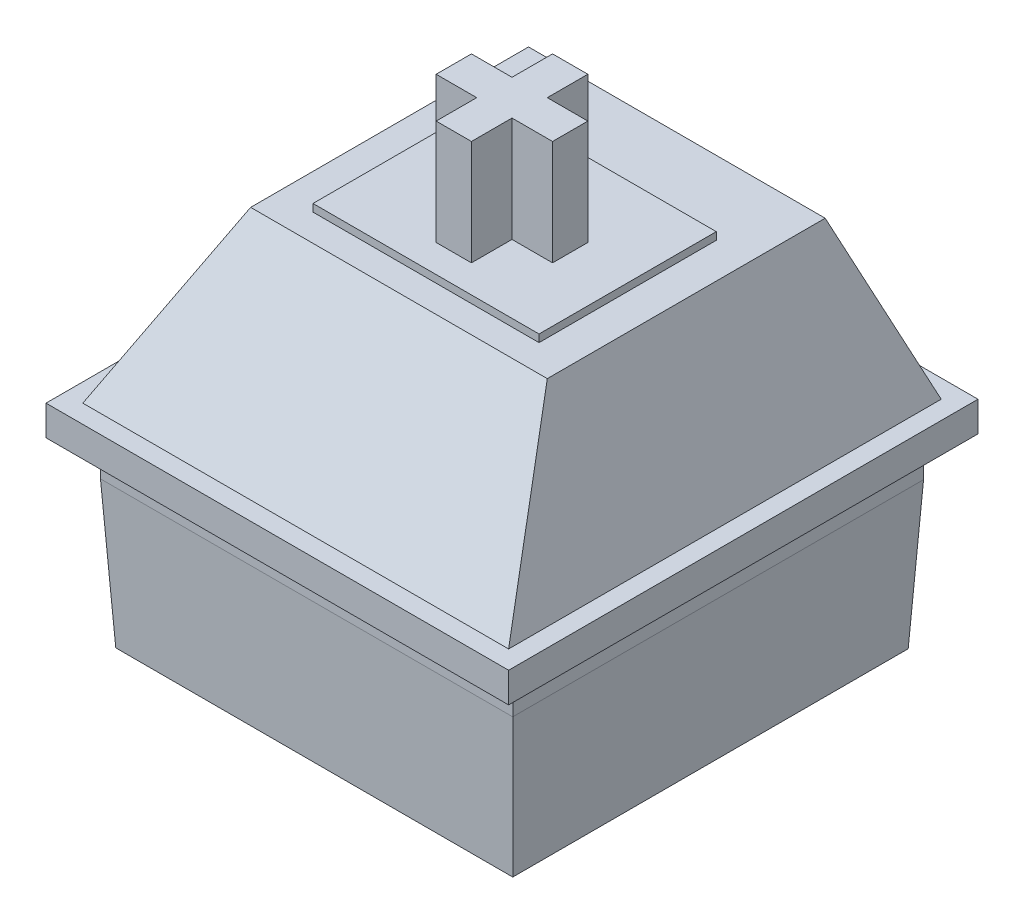
ISO-10303-21;
HEADER;
FILE_DESCRIPTION(('STEP AP214'),'2;1');
FILE_NAME('part.step','',(''),(''),'','','');
FILE_SCHEMA(('AUTOMOTIVE_DESIGN { 1 0 10303 214 1 1 1 1 }'));
ENDSEC;
DATA;
#1=APPLICATION_CONTEXT('core data for automotive mechanical design processes');
#2=APPLICATION_PROTOCOL_DEFINITION('international standard','automotive_design',2000,#1);
#3=PRODUCT_CONTEXT('',#1,'mechanical');
#4=PRODUCT('Part','Part','',(#3));
#5=PRODUCT_RELATED_PRODUCT_CATEGORY('part','',(#4));
#6=PRODUCT_DEFINITION_FORMATION('','',#4);
#7=PRODUCT_DEFINITION_CONTEXT('part definition',#1,'design');
#8=PRODUCT_DEFINITION('design','',#6,#7);
#9=PRODUCT_DEFINITION_SHAPE('','',#8);
#10=(LENGTH_UNIT() NAMED_UNIT(*) SI_UNIT(.MILLI.,.METRE.));
#11=(NAMED_UNIT(*) PLANE_ANGLE_UNIT() SI_UNIT($,.RADIAN.));
#12=(NAMED_UNIT(*) SI_UNIT($,.STERADIAN.) SOLID_ANGLE_UNIT());
#13=UNCERTAINTY_MEASURE_WITH_UNIT(LENGTH_MEASURE(1.E-05),#10,'distance_accuracy_value','');
#14=(GEOMETRIC_REPRESENTATION_CONTEXT(3) GLOBAL_UNCERTAINTY_ASSIGNED_CONTEXT((#13)) GLOBAL_UNIT_ASSIGNED_CONTEXT((#10,
#11,#12)) REPRESENTATION_CONTEXT('',''));
#15=CARTESIAN_POINT('',(0.,0.,0.));
#16=DIRECTION('',(0.,0.,1.));
#17=DIRECTION('',(1.,0.,0.));
#18=AXIS2_PLACEMENT_3D('',#15,#16,#17);
#19=CARTESIAN_POINT('',(0.,7.62,0.));
#20=DIRECTION('',(0.,1.,0.));
#21=DIRECTION('',(0.,0.,1.));
#22=AXIS2_PLACEMENT_3D('',#19,#20,#21);
#23=PLANE('',#22);
#24=DIRECTION('',(0.,0.,1.));
#25=VECTOR('',#24,1.);
#26=CARTESIAN_POINT('',(-3.8227,7.62,-3.0861));
#27=LINE('',#26,#25);
#28=CARTESIAN_POINT('',(-3.8227,7.62,-3.0861));
#29=VERTEX_POINT('',#28);
#30=CARTESIAN_POINT('',(-3.8227,7.62,2.9083));
#31=VERTEX_POINT('',#30);
#32=EDGE_CURVE('E499',#29,#31,#27,.T.);
#33=ORIENTED_EDGE('',*,*,#32,.T.);
#34=DIRECTION('',(1.,0.,0.));
#35=VECTOR('',#34,1.);
#36=CARTESIAN_POINT('',(-3.8227,7.62,2.9083));
#37=LINE('',#36,#35);
#38=CARTESIAN_POINT('',(3.8227,7.62,2.9083));
#39=VERTEX_POINT('',#38);
#40=EDGE_CURVE('E511',#31,#39,#37,.T.);
#41=ORIENTED_EDGE('',*,*,#40,.T.);
#42=DIRECTION('',(0.,0.,-1.));
#43=VECTOR('',#42,1.);
#44=CARTESIAN_POINT('',(3.8227,7.62,-3.0861));
#45=LINE('',#44,#43);
#46=CARTESIAN_POINT('',(3.8227,7.62,-3.0861));
#47=VERTEX_POINT('',#46);
#48=EDGE_CURVE('E509',#39,#47,#45,.T.);
#49=ORIENTED_EDGE('',*,*,#48,.T.);
#50=DIRECTION('',(-1.,0.,0.));
#51=VECTOR('',#50,1.);
#52=CARTESIAN_POINT('',(-3.8227,7.62,-3.0861));
#53=LINE('',#52,#51);
#54=EDGE_CURVE('E496',#47,#29,#53,.T.);
#55=ORIENTED_EDGE('',*,*,#54,.T.);
#56=EDGE_LOOP('',(#33,#41,#49,#55));
#57=FACE_BOUND('',#56,.T.);
#58=DIRECTION('',(0.,0.,1.));
#59=VECTOR('',#58,1.);
#60=CARTESIAN_POINT('',(-1.9685,7.62,0.596899999999991));
#61=LINE('',#60,#59);
#62=CARTESIAN_POINT('',(-1.9685,7.62,-0.596900000000006));
#63=VERTEX_POINT('',#62);
#64=CARTESIAN_POINT('',(-1.9685,7.62,0.596899999999991));
#65=VERTEX_POINT('',#64);
#66=EDGE_CURVE('E568',#63,#65,#61,.T.);
#67=ORIENTED_EDGE('',*,*,#66,.F.);
#68=DIRECTION('',(-1.,0.,0.));
#69=VECTOR('',#68,1.);
#70=CARTESIAN_POINT('',(-1.9685,7.62,-0.596900000000006));
#71=LINE('',#70,#69);
#72=CARTESIAN_POINT('',(-0.596899999999997,7.62,-0.596900000000006));
#73=VERTEX_POINT('',#72);
#74=EDGE_CURVE('E256',#73,#63,#71,.T.);
#75=ORIENTED_EDGE('',*,*,#74,.F.);
#76=DIRECTION('',(0.,0.,1.));
#77=VECTOR('',#76,1.);
#78=CARTESIAN_POINT('',(-0.596899999999997,7.62,-0.596900000000006));
#79=LINE('',#78,#77);
#80=CARTESIAN_POINT('',(-0.596899999999997,7.62,-1.96850000000001));
#81=VERTEX_POINT('',#80);
#82=EDGE_CURVE('E547',#81,#73,#79,.T.);
#83=ORIENTED_EDGE('',*,*,#82,.F.);
#84=DIRECTION('',(-1.,0.,0.));
#85=VECTOR('',#84,1.);
#86=CARTESIAN_POINT('',(-0.596899999999997,7.62,-1.96850000000001));
#87=LINE('',#86,#85);
#88=CARTESIAN_POINT('',(0.596900000000003,7.62,-1.96850000000001));
#89=VERTEX_POINT('',#88);
#90=EDGE_CURVE('E550',#89,#81,#87,.T.);
#91=ORIENTED_EDGE('',*,*,#90,.F.);
#92=DIRECTION('',(0.,0.,-1.));
#93=VECTOR('',#92,1.);
#94=CARTESIAN_POINT('',(0.596900000000003,7.62,-1.96850000000001));
#95=LINE('',#94,#93);
#96=CARTESIAN_POINT('',(0.596899999999999,7.62,-0.596900000000006));
#97=VERTEX_POINT('',#96);
#98=EDGE_CURVE('E552',#97,#89,#95,.T.);
#99=ORIENTED_EDGE('',*,*,#98,.F.);
#100=DIRECTION('',(-1.,0.,0.));
#101=VECTOR('',#100,1.);
#102=CARTESIAN_POINT('',(0.596899999999999,7.62,-0.596900000000006));
#103=LINE('',#102,#101);
#104=CARTESIAN_POINT('',(1.9685,7.62,-0.596900000000006));
#105=VERTEX_POINT('',#104);
#106=EDGE_CURVE('E554',#105,#97,#103,.T.);
#107=ORIENTED_EDGE('',*,*,#106,.F.);
#108=DIRECTION('',(0.,0.,-1.));
#109=VECTOR('',#108,1.);
#110=CARTESIAN_POINT('',(1.9685,7.62,-0.596900000000006));
#111=LINE('',#110,#109);
#112=CARTESIAN_POINT('',(1.9685,7.62,0.596899999999994));
#113=VERTEX_POINT('',#112);
#114=EDGE_CURVE('E556',#113,#105,#111,.T.);
#115=ORIENTED_EDGE('',*,*,#114,.F.);
#116=DIRECTION('',(1.,0.,0.));
#117=VECTOR('',#116,1.);
#118=CARTESIAN_POINT('',(1.9685,7.62,0.596899999999994));
#119=LINE('',#118,#117);
#120=CARTESIAN_POINT('',(0.596899999999999,7.62,0.596900000000006));
#121=VERTEX_POINT('',#120);
#122=EDGE_CURVE('E558',#121,#113,#119,.T.);
#123=ORIENTED_EDGE('',*,*,#122,.F.);
#124=DIRECTION('',(0.,0.,-1.));
#125=VECTOR('',#124,1.);
#126=CARTESIAN_POINT('',(0.596899999999999,7.62,0.596900000000006));
#127=LINE('',#126,#125);
#128=CARTESIAN_POINT('',(0.596900000000003,7.62,1.96849999999999));
#129=VERTEX_POINT('',#128);
#130=EDGE_CURVE('E560',#129,#121,#127,.T.);
#131=ORIENTED_EDGE('',*,*,#130,.F.);
#132=DIRECTION('',(1.,0.,0.));
#133=VECTOR('',#132,1.);
#134=CARTESIAN_POINT('',(0.596900000000003,7.62,1.96849999999999));
#135=LINE('',#134,#133);
#136=CARTESIAN_POINT('',(-0.596899999999997,7.62,1.96849999999999));
#137=VERTEX_POINT('',#136);
#138=EDGE_CURVE('E562',#137,#129,#135,.T.);
#139=ORIENTED_EDGE('',*,*,#138,.F.);
#140=DIRECTION('',(0.,0.,1.));
#141=VECTOR('',#140,1.);
#142=CARTESIAN_POINT('',(-0.596899999999997,7.62,1.96849999999999));
#143=LINE('',#142,#141);
#144=CARTESIAN_POINT('',(-0.596899999999997,7.62,0.596900000000006));
#145=VERTEX_POINT('',#144);
#146=EDGE_CURVE('E564',#145,#137,#143,.T.);
#147=ORIENTED_EDGE('',*,*,#146,.F.);
#148=DIRECTION('',(1.,0.,0.));
#149=VECTOR('',#148,1.);
#150=CARTESIAN_POINT('',(-0.596899999999997,7.62,0.596900000000006));
#151=LINE('',#150,#149);
#152=EDGE_CURVE('E566',#65,#145,#151,.T.);
#153=ORIENTED_EDGE('',*,*,#152,.F.);
#154=EDGE_LOOP('',(#67,#75,#83,#91,#99,#107,#115,#123,#131,#139,#147,#153));
#155=FACE_BOUND('',#154,.T.);
#156=ADVANCED_FACE('F45',(#57,#155),#23,.T.);
#157=CARTESIAN_POINT('',(0.,7.366,0.));
#158=DIRECTION('',(0.,1.,0.));
#159=DIRECTION('',(0.,0.,1.));
#160=AXIS2_PLACEMENT_3D('',#157,#158,#159);
#161=PLANE('',#160);
#162=DIRECTION('',(0.,0.,1.));
#163=VECTOR('',#162,1.);
#164=CARTESIAN_POINT('',(-5.0165,7.366,-5.5753));
#165=LINE('',#164,#163);
#166=CARTESIAN_POINT('',(-5.0165,7.366,-5.5753));
#167=VERTEX_POINT('',#166);
#168=CARTESIAN_POINT('',(-5.0165,7.366,3.8227));
#169=VERTEX_POINT('',#168);
#170=EDGE_CURVE('E460',#167,#169,#165,.T.);
#171=ORIENTED_EDGE('',*,*,#170,.T.);
#172=DIRECTION('',(1.,0.,0.));
#173=VECTOR('',#172,1.);
#174=CARTESIAN_POINT('',(-5.0165,7.366,3.8227));
#175=LINE('',#174,#173);
#176=CARTESIAN_POINT('',(5.0165,7.366,3.8227));
#177=VERTEX_POINT('',#176);
#178=EDGE_CURVE('E332',#169,#177,#175,.T.);
#179=ORIENTED_EDGE('',*,*,#178,.T.);
#180=DIRECTION('',(0.,0.,-1.));
#181=VECTOR('',#180,1.);
#182=CARTESIAN_POINT('',(5.0165,7.366,-5.5753));
#183=LINE('',#182,#181);
#184=CARTESIAN_POINT('',(5.0165,7.366,-5.5753));
#185=VERTEX_POINT('',#184);
#186=EDGE_CURVE('E343',#177,#185,#183,.T.);
#187=ORIENTED_EDGE('',*,*,#186,.T.);
#188=DIRECTION('',(-1.,0.,0.));
#189=VECTOR('',#188,1.);
#190=CARTESIAN_POINT('',(-5.0165,7.366,-5.5753));
#191=LINE('',#190,#189);
#192=EDGE_CURVE('E463',#185,#167,#191,.T.);
#193=ORIENTED_EDGE('',*,*,#192,.T.);
#194=EDGE_LOOP('',(#171,#179,#187,#193));
#195=FACE_BOUND('',#194,.T.);
#196=DIRECTION('',(1.,0.,0.));
#197=VECTOR('',#196,1.);
#198=CARTESIAN_POINT('',(-3.8227,7.366,2.9083));
#199=LINE('',#198,#197);
#200=CARTESIAN_POINT('',(-3.8227,7.366,2.9083));
#201=VERTEX_POINT('',#200);
#202=CARTESIAN_POINT('',(3.8227,7.366,2.9083));
#203=VERTEX_POINT('',#202);
#204=EDGE_CURVE('E502',#201,#203,#199,.T.);
#205=ORIENTED_EDGE('',*,*,#204,.F.);
#206=DIRECTION('',(0.,0.,1.));
#207=VECTOR('',#206,1.);
#208=CARTESIAN_POINT('',(-3.8227,7.366,-3.0861));
#209=LINE('',#208,#207);
#210=CARTESIAN_POINT('',(-3.8227,7.366,-3.0861));
#211=VERTEX_POINT('',#210);
#212=EDGE_CURVE('E504',#211,#201,#209,.T.);
#213=ORIENTED_EDGE('',*,*,#212,.F.);
#214=DIRECTION('',(-1.,0.,0.));
#215=VECTOR('',#214,1.);
#216=CARTESIAN_POINT('',(-3.8227,7.366,-3.0861));
#217=LINE('',#216,#215);
#218=CARTESIAN_POINT('',(3.8227,7.366,-3.0861));
#219=VERTEX_POINT('',#218);
#220=EDGE_CURVE('E497',#219,#211,#217,.T.);
#221=ORIENTED_EDGE('',*,*,#220,.F.);
#222=DIRECTION('',(0.,0.,-1.));
#223=VECTOR('',#222,1.);
#224=CARTESIAN_POINT('',(3.8227,7.366,-3.0861));
#225=LINE('',#224,#223);
#226=EDGE_CURVE('E500',#203,#219,#225,.T.);
#227=ORIENTED_EDGE('',*,*,#226,.F.);
#228=EDGE_LOOP('',(#205,#213,#221,#227));
#229=FACE_BOUND('',#228,.T.);
#230=ADVANCED_FACE('F403',(#195,#229),#161,.T.);
#231=CARTESIAN_POINT('',(6.9723,1.27,6.9469));
#232=DIRECTION('',(-1.,0.,0.));
#233=DIRECTION('',(0.,0.,1.));
#234=AXIS2_PLACEMENT_3D('',#231,#232,#233);
#235=PLANE('',#234);
#236=DIRECTION('',(0.,0.,-1.));
#237=VECTOR('',#236,1.);
#238=CARTESIAN_POINT('',(6.9723,0.,6.9469));
#239=LINE('',#238,#237);
#240=CARTESIAN_POINT('',(6.9723,0.,6.9469));
#241=VERTEX_POINT('',#240);
#242=CARTESIAN_POINT('',(6.9723,0.,-6.9469));
#243=VERTEX_POINT('',#242);
#244=EDGE_CURVE('E250',#241,#243,#239,.T.);
#245=ORIENTED_EDGE('',*,*,#244,.T.);
#246=DIRECTION('',(0.,-1.,0.));
#247=VECTOR('',#246,1.);
#248=CARTESIAN_POINT('',(6.9723,1.27,-6.9469));
#249=LINE('',#248,#247);
#250=CARTESIAN_POINT('',(6.9723,1.27,-6.9469));
#251=VERTEX_POINT('',#250);
#252=EDGE_CURVE('E12',#251,#243,#249,.T.);
#253=ORIENTED_EDGE('',*,*,#252,.F.);
#254=DIRECTION('',(0.,0.,-1.));
#255=VECTOR('',#254,1.);
#256=CARTESIAN_POINT('',(6.9723,1.27,6.9469));
#257=LINE('',#256,#255);
#258=CARTESIAN_POINT('',(6.9723,1.27,6.9469));
#259=VERTEX_POINT('',#258);
#260=EDGE_CURVE('E292',#259,#251,#257,.T.);
#261=ORIENTED_EDGE('',*,*,#260,.F.);
#262=DIRECTION('',(0.,-1.,0.));
#263=VECTOR('',#262,1.);
#264=CARTESIAN_POINT('',(6.9723,1.27,6.9469));
#265=LINE('',#264,#263);
#266=EDGE_CURVE('E277',#259,#241,#265,.T.);
#267=ORIENTED_EDGE('',*,*,#266,.T.);
#268=EDGE_LOOP('',(#245,#253,#261,#267));
#269=FACE_BOUND('',#268,.T.);
#270=ADVANCED_FACE('F47',(#269),#235,.F.);
#271=CARTESIAN_POINT('',(-6.9723,1.27,-6.9469));
#272=DIRECTION('',(0.,0.,1.));
#273=DIRECTION('',(1.,0.,0.));
#274=AXIS2_PLACEMENT_3D('',#271,#272,#273);
#275=PLANE('',#274);
#276=DIRECTION('',(-1.,0.,0.));
#277=VECTOR('',#276,1.);
#278=CARTESIAN_POINT('',(-6.9723,0.,-6.9469));
#279=LINE('',#278,#277);
#280=CARTESIAN_POINT('',(-6.9723,0.,-6.9469));
#281=VERTEX_POINT('',#280);
#282=EDGE_CURVE('E260',#243,#281,#279,.T.);
#283=ORIENTED_EDGE('',*,*,#282,.T.);
#284=DIRECTION('',(0.,-1.,0.));
#285=VECTOR('',#284,1.);
#286=CARTESIAN_POINT('',(-6.9723,1.27,-6.9469));
#287=LINE('',#286,#285);
#288=CARTESIAN_POINT('',(-6.9723,1.27,-6.9469));
#289=VERTEX_POINT('',#288);
#290=EDGE_CURVE('E54',#289,#281,#287,.T.);
#291=ORIENTED_EDGE('',*,*,#290,.F.);
#292=DIRECTION('',(-1.,0.,0.));
#293=VECTOR('',#292,1.);
#294=CARTESIAN_POINT('',(-6.9723,1.27,-6.9469));
#295=LINE('',#294,#293);
#296=EDGE_CURVE('E272',#251,#289,#295,.T.);
#297=ORIENTED_EDGE('',*,*,#296,.F.);
#298=ORIENTED_EDGE('',*,*,#252,.T.);
#299=EDGE_LOOP('',(#283,#291,#297,#298));
#300=FACE_BOUND('',#299,.T.);
#301=ADVANCED_FACE('F270',(#300),#275,.F.);
#302=CARTESIAN_POINT('',(-6.9723,1.27,6.9469));
#303=DIRECTION('',(1.,0.,0.));
#304=DIRECTION('',(0.,0.,-1.));
#305=AXIS2_PLACEMENT_3D('',#302,#303,#304);
#306=PLANE('',#305);
#307=DIRECTION('',(0.,0.,1.));
#308=VECTOR('',#307,1.);
#309=CARTESIAN_POINT('',(-6.9723,0.,6.9469));
#310=LINE('',#309,#308);
#311=CARTESIAN_POINT('',(-6.9723,0.,6.9469));
#312=VERTEX_POINT('',#311);
#313=EDGE_CURVE('E267',#281,#312,#310,.T.);
#314=ORIENTED_EDGE('',*,*,#313,.T.);
#315=DIRECTION('',(0.,-1.,0.));
#316=VECTOR('',#315,1.);
#317=CARTESIAN_POINT('',(-6.9723,1.27,6.9469));
#318=LINE('',#317,#316);
#319=CARTESIAN_POINT('',(-6.9723,1.27,6.9469));
#320=VERTEX_POINT('',#319);
#321=EDGE_CURVE('E294',#320,#312,#318,.T.);
#322=ORIENTED_EDGE('',*,*,#321,.F.);
#323=DIRECTION('',(0.,0.,1.));
#324=VECTOR('',#323,1.);
#325=CARTESIAN_POINT('',(-6.9723,1.27,6.9469));
#326=LINE('',#325,#324);
#327=EDGE_CURVE('E617',#289,#320,#326,.T.);
#328=ORIENTED_EDGE('',*,*,#327,.F.);
#329=ORIENTED_EDGE('',*,*,#290,.T.);
#330=EDGE_LOOP('',(#314,#322,#328,#329));
#331=FACE_BOUND('',#330,.T.);
#332=ADVANCED_FACE('F395',(#331),#306,.F.);
#333=CARTESIAN_POINT('',(-6.9723,1.27,6.9469));
#334=DIRECTION('',(0.,0.,-1.));
#335=DIRECTION('',(-1.,0.,0.));
#336=AXIS2_PLACEMENT_3D('',#333,#334,#335);
#337=PLANE('',#336);
#338=DIRECTION('',(1.,0.,0.));
#339=VECTOR('',#338,1.);
#340=CARTESIAN_POINT('',(-6.9723,0.,6.9469));
#341=LINE('',#340,#339);
#342=EDGE_CURVE('E289',#312,#241,#341,.T.);
#343=ORIENTED_EDGE('',*,*,#342,.T.);
#344=ORIENTED_EDGE('',*,*,#266,.F.);
#345=DIRECTION('',(1.,0.,0.));
#346=VECTOR('',#345,1.);
#347=CARTESIAN_POINT('',(-6.9723,1.27,6.9469));
#348=LINE('',#347,#346);
#349=EDGE_CURVE('E284',#320,#259,#348,.T.);
#350=ORIENTED_EDGE('',*,*,#349,.F.);
#351=ORIENTED_EDGE('',*,*,#321,.T.);
#352=EDGE_LOOP('',(#343,#344,#350,#351));
#353=FACE_BOUND('',#352,.T.);
#354=ADVANCED_FACE('F377',(#353),#337,.F.);
#355=CARTESIAN_POINT('',(0.,1.27,0.));
#356=DIRECTION('',(0.,-1.,0.));
#357=DIRECTION('',(0.,0.,-1.));
#358=AXIS2_PLACEMENT_3D('',#355,#356,#357);
#359=PLANE('',#358);
#360=DIRECTION('',(0.,0.,-1.));
#361=VECTOR('',#360,1.);
#362=CARTESIAN_POINT('',(7.8232,1.27,7.9375));
#363=LINE('',#362,#361);
#364=CARTESIAN_POINT('',(7.8232,1.27,7.9375));
#365=VERTEX_POINT('',#364);
#366=CARTESIAN_POINT('',(7.8232,1.27,-7.9375));
#367=VERTEX_POINT('',#366);
#368=EDGE_CURVE('E312',#365,#367,#363,.T.);
#369=ORIENTED_EDGE('',*,*,#368,.F.);
#370=DIRECTION('',(1.,0.,0.));
#371=VECTOR('',#370,1.);
#372=CARTESIAN_POINT('',(-7.8232,1.27,7.9375));
#373=LINE('',#372,#371);
#374=CARTESIAN_POINT('',(-7.8232,1.27,7.9375));
#375=VERTEX_POINT('',#374);
#376=EDGE_CURVE('E630',#375,#365,#373,.T.);
#377=ORIENTED_EDGE('',*,*,#376,.F.);
#378=DIRECTION('',(0.,0.,1.));
#379=VECTOR('',#378,1.);
#380=CARTESIAN_POINT('',(-7.8232,1.27,7.9375));
#381=LINE('',#380,#379);
#382=CARTESIAN_POINT('',(-7.8232,1.27,-7.9375));
#383=VERTEX_POINT('',#382);
#384=EDGE_CURVE('E633',#383,#375,#381,.T.);
#385=ORIENTED_EDGE('',*,*,#384,.F.);
#386=DIRECTION('',(-1.,0.,0.));
#387=VECTOR('',#386,1.);
#388=CARTESIAN_POINT('',(-7.8232,1.27,-7.9375));
#389=LINE('',#388,#387);
#390=EDGE_CURVE('E635',#367,#383,#389,.T.);
#391=ORIENTED_EDGE('',*,*,#390,.F.);
#392=EDGE_LOOP('',(#369,#377,#385,#391));
#393=FACE_BOUND('',#392,.T.);
#394=ORIENTED_EDGE('',*,*,#260,.T.);
#395=ORIENTED_EDGE('',*,*,#296,.T.);
#396=ORIENTED_EDGE('',*,*,#327,.T.);
#397=ORIENTED_EDGE('',*,*,#349,.T.);
#398=EDGE_LOOP('',(#394,#395,#396,#397));
#399=FACE_BOUND('',#398,.T.);
#400=ADVANCED_FACE('F373',(#393,#399),#359,.T.);
#401=CARTESIAN_POINT('',(7.8232,2.286,7.9375));
#402=DIRECTION('',(-1.,0.,0.));
#403=DIRECTION('',(0.,0.,1.));
#404=AXIS2_PLACEMENT_3D('',#401,#402,#403);
#405=PLANE('',#404);
#406=ORIENTED_EDGE('',*,*,#368,.T.);
#407=DIRECTION('',(0.,-1.,0.));
#408=VECTOR('',#407,1.);
#409=CARTESIAN_POINT('',(7.8232,2.286,-7.9375));
#410=LINE('',#409,#408);
#411=CARTESIAN_POINT('',(7.8232,2.286,-7.9375));
#412=VERTEX_POINT('',#411);
#413=EDGE_CURVE('E278',#412,#367,#410,.T.);
#414=ORIENTED_EDGE('',*,*,#413,.F.);
#415=DIRECTION('',(0.,0.,-1.));
#416=VECTOR('',#415,1.);
#417=CARTESIAN_POINT('',(7.8232,2.286,7.9375));
#418=LINE('',#417,#416);
#419=CARTESIAN_POINT('',(7.8232,2.286,7.9375));
#420=VERTEX_POINT('',#419);
#421=EDGE_CURVE('E632',#420,#412,#418,.T.);
#422=ORIENTED_EDGE('',*,*,#421,.F.);
#423=DIRECTION('',(0.,-1.,0.));
#424=VECTOR('',#423,1.);
#425=CARTESIAN_POINT('',(7.8232,2.286,7.9375));
#426=LINE('',#425,#424);
#427=EDGE_CURVE('E626',#420,#365,#426,.T.);
#428=ORIENTED_EDGE('',*,*,#427,.T.);
#429=EDGE_LOOP('',(#406,#414,#422,#428));
#430=FACE_BOUND('',#429,.T.);
#431=ADVANCED_FACE('F376',(#430),#405,.F.);
#432=CARTESIAN_POINT('',(-7.8232,2.286,-7.9375));
#433=DIRECTION('',(0.,0.,1.));
#434=DIRECTION('',(1.,0.,0.));
#435=AXIS2_PLACEMENT_3D('',#432,#433,#434);
#436=PLANE('',#435);
#437=ORIENTED_EDGE('',*,*,#390,.T.);
#438=DIRECTION('',(0.,-1.,0.));
#439=VECTOR('',#438,1.);
#440=CARTESIAN_POINT('',(-7.8232,2.286,-7.9375));
#441=LINE('',#440,#439);
#442=CARTESIAN_POINT('',(-7.8232,2.286,-7.9375));
#443=VERTEX_POINT('',#442);
#444=EDGE_CURVE('E281',#443,#383,#441,.T.);
#445=ORIENTED_EDGE('',*,*,#444,.F.);
#446=DIRECTION('',(-1.,0.,0.));
#447=VECTOR('',#446,1.);
#448=CARTESIAN_POINT('',(-7.8232,2.286,-7.9375));
#449=LINE('',#448,#447);
#450=EDGE_CURVE('E642',#412,#443,#449,.T.);
#451=ORIENTED_EDGE('',*,*,#450,.F.);
#452=ORIENTED_EDGE('',*,*,#413,.T.);
#453=EDGE_LOOP('',(#437,#445,#451,#452));
#454=FACE_BOUND('',#453,.T.);
#455=ADVANCED_FACE('F385',(#454),#436,.F.);
#456=CARTESIAN_POINT('',(-7.8232,2.286,7.9375));
#457=DIRECTION('',(1.,0.,0.));
#458=DIRECTION('',(0.,0.,-1.));
#459=AXIS2_PLACEMENT_3D('',#456,#457,#458);
#460=PLANE('',#459);
#461=ORIENTED_EDGE('',*,*,#384,.T.);
#462=DIRECTION('',(0.,-1.,0.));
#463=VECTOR('',#462,1.);
#464=CARTESIAN_POINT('',(-7.8232,2.286,7.9375));
#465=LINE('',#464,#463);
#466=CARTESIAN_POINT('',(-7.8232,2.286,7.9375));
#467=VERTEX_POINT('',#466);
#468=EDGE_CURVE('E623',#467,#375,#465,.T.);
#469=ORIENTED_EDGE('',*,*,#468,.F.);
#470=DIRECTION('',(0.,0.,1.));
#471=VECTOR('',#470,1.);
#472=CARTESIAN_POINT('',(-7.8232,2.286,7.9375));
#473=LINE('',#472,#471);
#474=EDGE_CURVE('E640',#443,#467,#473,.T.);
#475=ORIENTED_EDGE('',*,*,#474,.F.);
#476=ORIENTED_EDGE('',*,*,#444,.T.);
#477=EDGE_LOOP('',(#461,#469,#475,#476));
#478=FACE_BOUND('',#477,.T.);
#479=ADVANCED_FACE('F381',(#478),#460,.F.);
#480=CARTESIAN_POINT('',(-7.8232,2.286,7.9375));
#481=DIRECTION('',(0.,0.,-1.));
#482=DIRECTION('',(-1.,0.,0.));
#483=AXIS2_PLACEMENT_3D('',#480,#481,#482);
#484=PLANE('',#483);
#485=ORIENTED_EDGE('',*,*,#376,.T.);
#486=ORIENTED_EDGE('',*,*,#427,.F.);
#487=DIRECTION('',(1.,0.,0.));
#488=VECTOR('',#487,1.);
#489=CARTESIAN_POINT('',(-7.8232,2.286,7.9375));
#490=LINE('',#489,#488);
#491=EDGE_CURVE('E629',#467,#420,#490,.T.);
#492=ORIENTED_EDGE('',*,*,#491,.F.);
#493=ORIENTED_EDGE('',*,*,#468,.T.);
#494=EDGE_LOOP('',(#485,#486,#492,#493));
#495=FACE_BOUND('',#494,.T.);
#496=ADVANCED_FACE('F372',(#495),#484,.F.);
#497=CARTESIAN_POINT('',(0.,2.286,0.));
#498=DIRECTION('',(0.,-1.,0.));
#499=DIRECTION('',(0.,0.,-1.));
#500=AXIS2_PLACEMENT_3D('',#497,#498,#499);
#501=PLANE('',#500);
#502=DIRECTION('',(-1.,0.,0.));
#503=VECTOR('',#502,1.);
#504=CARTESIAN_POINT('',(-7.2009,2.286,-7.3152));
#505=LINE('',#504,#503);
#506=CARTESIAN_POINT('',(7.2009,2.286,-7.3152));
#507=VERTEX_POINT('',#506);
#508=CARTESIAN_POINT('',(-7.2009,2.286,-7.3152));
#509=VERTEX_POINT('',#508);
#510=EDGE_CURVE('E298',#507,#509,#505,.T.);
#511=ORIENTED_EDGE('',*,*,#510,.F.);
#512=DIRECTION('',(0.,0.,-1.));
#513=VECTOR('',#512,1.);
#514=CARTESIAN_POINT('',(7.2009,2.286,7.3152));
#515=LINE('',#514,#513);
#516=CARTESIAN_POINT('',(7.2009,2.286,7.3152));
#517=VERTEX_POINT('',#516);
#518=EDGE_CURVE('E301',#517,#507,#515,.T.);
#519=ORIENTED_EDGE('',*,*,#518,.F.);
#520=DIRECTION('',(1.,0.,0.));
#521=VECTOR('',#520,1.);
#522=CARTESIAN_POINT('',(-7.2009,2.286,7.3152));
#523=LINE('',#522,#521);
#524=CARTESIAN_POINT('',(-7.2009,2.286,7.3152));
#525=VERTEX_POINT('',#524);
#526=EDGE_CURVE('E309',#525,#517,#523,.T.);
#527=ORIENTED_EDGE('',*,*,#526,.F.);
#528=DIRECTION('',(0.,0.,1.));
#529=VECTOR('',#528,1.);
#530=CARTESIAN_POINT('',(-7.2009,2.286,7.3152));
#531=LINE('',#530,#529);
#532=EDGE_CURVE('E300',#509,#525,#531,.T.);
#533=ORIENTED_EDGE('',*,*,#532,.F.);
#534=EDGE_LOOP('',(#511,#519,#527,#533));
#535=FACE_BOUND('',#534,.T.);
#536=ORIENTED_EDGE('',*,*,#421,.T.);
#537=ORIENTED_EDGE('',*,*,#450,.T.);
#538=ORIENTED_EDGE('',*,*,#474,.T.);
#539=ORIENTED_EDGE('',*,*,#491,.T.);
#540=EDGE_LOOP('',(#536,#537,#538,#539));
#541=FACE_BOUND('',#540,.T.);
#542=ADVANCED_FACE('F336',(#535,#541),#501,.F.);
#543=CARTESIAN_POINT('',(0.,2.48241526215395,-7.24792777271227));
#544=DIRECTION('',(0.,0.324021972711407,-0.946049555361773));
#545=DIRECTION('',(0.,0.946049555361773,0.324021972711407));
#546=AXIS2_PLACEMENT_3D('',#543,#544,#545);
#547=PLANE('',#546);
#548=DIRECTION('',(0.376815334299498,-0.876314730929064,-0.300137795343205));
#549=VECTOR('',#548,1.);
#550=CARTESIAN_POINT('',(5.0165,7.366,-5.5753));
#551=LINE('',#550,#549);
#552=EDGE_CURVE('E340',#185,#507,#551,.T.);
#553=ORIENTED_EDGE('',*,*,#552,.T.);
#554=ORIENTED_EDGE('',*,*,#510,.T.);
#555=DIRECTION('',(-0.376815334299497,-0.876314730929065,-0.300137795343204));
#556=VECTOR('',#555,1.);
#557=CARTESIAN_POINT('',(-5.0165,7.366,-5.5753));
#558=LINE('',#557,#556);
#559=EDGE_CURVE('E323',#167,#509,#558,.T.);
#560=ORIENTED_EDGE('',*,*,#559,.F.);
#561=ORIENTED_EDGE('',*,*,#192,.F.);
#562=EDGE_LOOP('',(#553,#554,#560,#561));
#563=FACE_BOUND('',#562,.T.);
#564=ADVANCED_FACE('F371',(#563),#547,.T.);
#565=CARTESIAN_POINT('',(-6.90681070132501,2.96992860156975,0.));
#566=DIRECTION('',(-0.918669187580036,0.395027750659415,0.));
#567=DIRECTION('',(-0.395027750659415,-0.918669187580036,0.));
#568=AXIS2_PLACEMENT_3D('',#565,#566,#567);
#569=PLANE('',#568);
#570=ORIENTED_EDGE('',*,*,#559,.T.);
#571=ORIENTED_EDGE('',*,*,#532,.T.);
#572=DIRECTION('',(-0.333990656859469,-0.77672245781272,0.533996689746245));
#573=VECTOR('',#572,1.);
#574=CARTESIAN_POINT('',(-5.0165,7.366,3.8227));
#575=LINE('',#574,#573);
#576=EDGE_CURVE('E306',#169,#525,#575,.T.);
#577=ORIENTED_EDGE('',*,*,#576,.F.);
#578=ORIENTED_EDGE('',*,*,#170,.F.);
#579=EDGE_LOOP('',(#570,#571,#577,#578));
#580=FACE_BOUND('',#579,.T.);
#581=ADVANCED_FACE('F319',(#580),#569,.T.);
#582=CARTESIAN_POINT('',(6.90681070132501,2.96992860156975,0.));
#583=DIRECTION('',(0.918669187580036,0.395027750659415,0.));
#584=DIRECTION('',(-0.395027750659415,0.918669187580036,0.));
#585=AXIS2_PLACEMENT_3D('',#582,#583,#584);
#586=PLANE('',#585);
#587=DIRECTION('',(0.333990656859469,-0.77672245781272,0.533996689746245));
#588=VECTOR('',#587,1.);
#589=CARTESIAN_POINT('',(5.0165,7.366,3.8227));
#590=LINE('',#589,#588);
#591=EDGE_CURVE('E334',#177,#517,#590,.T.);
#592=ORIENTED_EDGE('',*,*,#591,.T.);
#593=ORIENTED_EDGE('',*,*,#518,.T.);
#594=ORIENTED_EDGE('',*,*,#552,.F.);
#595=ORIENTED_EDGE('',*,*,#186,.F.);
#596=EDGE_LOOP('',(#592,#593,#594,#595));
#597=FACE_BOUND('',#596,.T.);
#598=ADVANCED_FACE('F339',(#597),#586,.T.);
#599=CARTESIAN_POINT('',(0.,4.14875649867374,6.03455490716181));
#600=DIRECTION('',(0.,0.566528822887065,0.824041924199368));
#601=DIRECTION('',(0.,-0.824041924199368,0.566528822887065));
#602=AXIS2_PLACEMENT_3D('',#599,#600,#601);
#603=PLANE('',#602);
#604=ORIENTED_EDGE('',*,*,#576,.T.);
#605=ORIENTED_EDGE('',*,*,#526,.T.);
#606=ORIENTED_EDGE('',*,*,#591,.F.);
#607=ORIENTED_EDGE('',*,*,#178,.F.);
#608=EDGE_LOOP('',(#604,#605,#606,#607));
#609=FACE_BOUND('',#608,.T.);
#610=ADVANCED_FACE('F328',(#609),#603,.T.);
#611=CARTESIAN_POINT('',(-3.8227,7.62,-3.0861));
#612=DIRECTION('',(1.,0.,0.));
#613=DIRECTION('',(0.,0.,-1.));
#614=AXIS2_PLACEMENT_3D('',#611,#612,#613);
#615=PLANE('',#614);
#616=ORIENTED_EDGE('',*,*,#212,.T.);
#617=DIRECTION('',(0.,-1.,0.));
#618=VECTOR('',#617,1.);
#619=CARTESIAN_POINT('',(-3.8227,7.62,2.9083));
#620=LINE('',#619,#618);
#621=EDGE_CURVE('E473',#31,#201,#620,.T.);
#622=ORIENTED_EDGE('',*,*,#621,.F.);
#623=ORIENTED_EDGE('',*,*,#32,.F.);
#624=DIRECTION('',(0.,-1.,0.));
#625=VECTOR('',#624,1.);
#626=CARTESIAN_POINT('',(-3.8227,7.62,-3.0861));
#627=LINE('',#626,#625);
#628=EDGE_CURVE('E493',#29,#211,#627,.T.);
#629=ORIENTED_EDGE('',*,*,#628,.T.);
#630=EDGE_LOOP('',(#616,#622,#623,#629));
#631=FACE_BOUND('',#630,.T.);
#632=ADVANCED_FACE('F366',(#631),#615,.F.);
#633=CARTESIAN_POINT('',(-3.8227,7.62,2.9083));
#634=DIRECTION('',(0.,0.,-1.));
#635=DIRECTION('',(-1.,0.,0.));
#636=AXIS2_PLACEMENT_3D('',#633,#634,#635);
#637=PLANE('',#636);
#638=ORIENTED_EDGE('',*,*,#204,.T.);
#639=DIRECTION('',(0.,-1.,0.));
#640=VECTOR('',#639,1.);
#641=CARTESIAN_POINT('',(3.8227,7.62,2.9083));
#642=LINE('',#641,#640);
#643=EDGE_CURVE('E489',#39,#203,#642,.T.);
#644=ORIENTED_EDGE('',*,*,#643,.F.);
#645=ORIENTED_EDGE('',*,*,#40,.F.);
#646=ORIENTED_EDGE('',*,*,#621,.T.);
#647=EDGE_LOOP('',(#638,#644,#645,#646));
#648=FACE_BOUND('',#647,.T.);
#649=ADVANCED_FACE('F424',(#648),#637,.F.);
#650=CARTESIAN_POINT('',(3.8227,7.62,-3.0861));
#651=DIRECTION('',(-1.,0.,0.));
#652=DIRECTION('',(0.,0.,1.));
#653=AXIS2_PLACEMENT_3D('',#650,#651,#652);
#654=PLANE('',#653);
#655=ORIENTED_EDGE('',*,*,#226,.T.);
#656=DIRECTION('',(0.,-1.,0.));
#657=VECTOR('',#656,1.);
#658=CARTESIAN_POINT('',(3.8227,7.62,-3.0861));
#659=LINE('',#658,#657);
#660=EDGE_CURVE('E70',#47,#219,#659,.T.);
#661=ORIENTED_EDGE('',*,*,#660,.F.);
#662=ORIENTED_EDGE('',*,*,#48,.F.);
#663=ORIENTED_EDGE('',*,*,#643,.T.);
#664=EDGE_LOOP('',(#655,#661,#662,#663));
#665=FACE_BOUND('',#664,.T.);
#666=ADVANCED_FACE('F421',(#665),#654,.F.);
#667=CARTESIAN_POINT('',(-3.8227,7.62,-3.0861));
#668=DIRECTION('',(0.,0.,1.));
#669=DIRECTION('',(1.,0.,0.));
#670=AXIS2_PLACEMENT_3D('',#667,#668,#669);
#671=PLANE('',#670);
#672=ORIENTED_EDGE('',*,*,#220,.T.);
#673=ORIENTED_EDGE('',*,*,#628,.F.);
#674=ORIENTED_EDGE('',*,*,#54,.F.);
#675=ORIENTED_EDGE('',*,*,#660,.T.);
#676=EDGE_LOOP('',(#672,#673,#674,#675));
#677=FACE_BOUND('',#676,.T.);
#678=ADVANCED_FACE('F418',(#677),#671,.F.);
#679=CARTESIAN_POINT('',(-1.9685,11.176,-0.596900000000006));
#680=DIRECTION('',(0.,0.,1.));
#681=DIRECTION('',(1.,0.,0.));
#682=AXIS2_PLACEMENT_3D('',#679,#680,#681);
#683=PLANE('',#682);
#684=ORIENTED_EDGE('',*,*,#74,.T.);
#685=DIRECTION('',(0.,-1.,0.));
#686=VECTOR('',#685,1.);
#687=CARTESIAN_POINT('',(-1.9685,11.176,-0.596900000000006));
#688=LINE('',#687,#686);
#689=CARTESIAN_POINT('',(-1.9685,11.176,-0.596900000000006));
#690=VERTEX_POINT('',#689);
#691=EDGE_CURVE('E507',#690,#63,#688,.T.);
#692=ORIENTED_EDGE('',*,*,#691,.F.);
#693=DIRECTION('',(-1.,0.,0.));
#694=VECTOR('',#693,1.);
#695=CARTESIAN_POINT('',(-1.9685,11.176,-0.596900000000006));
#696=LINE('',#695,#694);
#697=CARTESIAN_POINT('',(-0.596899999999997,11.176,-0.596900000000006));
#698=VERTEX_POINT('',#697);
#699=EDGE_CURVE('E549',#698,#690,#696,.T.);
#700=ORIENTED_EDGE('',*,*,#699,.F.);
#701=DIRECTION('',(0.,-1.,0.));
#702=VECTOR('',#701,1.);
#703=CARTESIAN_POINT('',(-0.596899999999997,11.176,-0.596900000000006));
#704=LINE('',#703,#702);
#705=EDGE_CURVE('E543',#698,#73,#704,.T.);
#706=ORIENTED_EDGE('',*,*,#705,.T.);
#707=EDGE_LOOP('',(#684,#692,#700,#706));
#708=FACE_BOUND('',#707,.T.);
#709=ADVANCED_FACE('F416',(#708),#683,.F.);
#710=CARTESIAN_POINT('',(-1.9685,11.176,0.596899999999991));
#711=DIRECTION('',(1.,0.,0.));
#712=DIRECTION('',(0.,0.,-1.));
#713=AXIS2_PLACEMENT_3D('',#710,#711,#712);
#714=PLANE('',#713);
#715=ORIENTED_EDGE('',*,*,#66,.T.);
#716=DIRECTION('',(0.,-1.,0.));
#717=VECTOR('',#716,1.);
#718=CARTESIAN_POINT('',(-1.9685,11.176,0.596899999999991));
#719=LINE('',#718,#717);
#720=CARTESIAN_POINT('',(-1.9685,11.176,0.596899999999991));
#721=VERTEX_POINT('',#720);
#722=EDGE_CURVE('E515',#721,#65,#719,.T.);
#723=ORIENTED_EDGE('',*,*,#722,.F.);
#724=DIRECTION('',(0.,0.,1.));
#725=VECTOR('',#724,1.);
#726=CARTESIAN_POINT('',(-1.9685,11.176,0.596899999999991));
#727=LINE('',#726,#725);
#728=EDGE_CURVE('E591',#690,#721,#727,.T.);
#729=ORIENTED_EDGE('',*,*,#728,.F.);
#730=ORIENTED_EDGE('',*,*,#691,.T.);
#731=EDGE_LOOP('',(#715,#723,#729,#730));
#732=FACE_BOUND('',#731,.T.);
#733=ADVANCED_FACE('F719',(#732),#714,.F.);
#734=CARTESIAN_POINT('',(-0.596899999999997,11.176,0.596900000000006));
#735=DIRECTION('',(0.,0.,-1.));
#736=DIRECTION('',(-1.,0.,0.));
#737=AXIS2_PLACEMENT_3D('',#734,#735,#736);
#738=PLANE('',#737);
#739=ORIENTED_EDGE('',*,*,#152,.T.);
#740=DIRECTION('',(0.,-1.,0.));
#741=VECTOR('',#740,1.);
#742=CARTESIAN_POINT('',(-0.596899999999997,11.176,0.596900000000006));
#743=LINE('',#742,#741);
#744=CARTESIAN_POINT('',(-0.596899999999997,11.176,0.596900000000006));
#745=VERTEX_POINT('',#744);
#746=EDGE_CURVE('E518',#745,#145,#743,.T.);
#747=ORIENTED_EDGE('',*,*,#746,.F.);
#748=DIRECTION('',(1.,0.,0.));
#749=VECTOR('',#748,1.);
#750=CARTESIAN_POINT('',(-0.596899999999997,11.176,0.596900000000006));
#751=LINE('',#750,#749);
#752=EDGE_CURVE('E589',#721,#745,#751,.T.);
#753=ORIENTED_EDGE('',*,*,#752,.F.);
#754=ORIENTED_EDGE('',*,*,#722,.T.);
#755=EDGE_LOOP('',(#739,#747,#753,#754));
#756=FACE_BOUND('',#755,.T.);
#757=ADVANCED_FACE('F716',(#756),#738,.F.);
#758=CARTESIAN_POINT('',(-0.596899999999997,11.176,1.96849999999999));
#759=DIRECTION('',(1.,0.,0.));
#760=DIRECTION('',(0.,0.,-1.));
#761=AXIS2_PLACEMENT_3D('',#758,#759,#760);
#762=PLANE('',#761);
#763=ORIENTED_EDGE('',*,*,#146,.T.);
#764=DIRECTION('',(0.,-1.,0.));
#765=VECTOR('',#764,1.);
#766=CARTESIAN_POINT('',(-0.596899999999997,11.176,1.96849999999999));
#767=LINE('',#766,#765);
#768=CARTESIAN_POINT('',(-0.596899999999997,11.176,1.96849999999999));
#769=VERTEX_POINT('',#768);
#770=EDGE_CURVE('E521',#769,#137,#767,.T.);
#771=ORIENTED_EDGE('',*,*,#770,.F.);
#772=DIRECTION('',(0.,0.,1.));
#773=VECTOR('',#772,1.);
#774=CARTESIAN_POINT('',(-0.596899999999997,11.176,1.96849999999999));
#775=LINE('',#774,#773);
#776=EDGE_CURVE('E587',#745,#769,#775,.T.);
#777=ORIENTED_EDGE('',*,*,#776,.F.);
#778=ORIENTED_EDGE('',*,*,#746,.T.);
#779=EDGE_LOOP('',(#763,#771,#777,#778));
#780=FACE_BOUND('',#779,.T.);
#781=ADVANCED_FACE('F712',(#780),#762,.F.);
#782=CARTESIAN_POINT('',(0.596900000000003,11.176,1.96849999999999));
#783=DIRECTION('',(0.,0.,-1.));
#784=DIRECTION('',(-1.,0.,0.));
#785=AXIS2_PLACEMENT_3D('',#782,#783,#784);
#786=PLANE('',#785);
#787=ORIENTED_EDGE('',*,*,#138,.T.);
#788=DIRECTION('',(0.,-1.,0.));
#789=VECTOR('',#788,1.);
#790=CARTESIAN_POINT('',(0.596900000000003,11.176,1.96849999999999));
#791=LINE('',#790,#789);
#792=CARTESIAN_POINT('',(0.596900000000003,11.176,1.96849999999999));
#793=VERTEX_POINT('',#792);
#794=EDGE_CURVE('E524',#793,#129,#791,.T.);
#795=ORIENTED_EDGE('',*,*,#794,.F.);
#796=DIRECTION('',(1.,0.,0.));
#797=VECTOR('',#796,1.);
#798=CARTESIAN_POINT('',(0.596900000000003,11.176,1.96849999999999));
#799=LINE('',#798,#797);
#800=EDGE_CURVE('E585',#769,#793,#799,.T.);
#801=ORIENTED_EDGE('',*,*,#800,.F.);
#802=ORIENTED_EDGE('',*,*,#770,.T.);
#803=EDGE_LOOP('',(#787,#795,#801,#802));
#804=FACE_BOUND('',#803,.T.);
#805=ADVANCED_FACE('F708',(#804),#786,.F.);
#806=CARTESIAN_POINT('',(0.596899999999999,11.176,0.596900000000006));
#807=DIRECTION('',(-1.,0.,0.));
#808=DIRECTION('',(0.,0.,1.));
#809=AXIS2_PLACEMENT_3D('',#806,#807,#808);
#810=PLANE('',#809);
#811=ORIENTED_EDGE('',*,*,#130,.T.);
#812=DIRECTION('',(0.,-1.,0.));
#813=VECTOR('',#812,1.);
#814=CARTESIAN_POINT('',(0.596899999999999,11.176,0.596900000000006));
#815=LINE('',#814,#813);
#816=CARTESIAN_POINT('',(0.596899999999999,11.176,0.596900000000006));
#817=VERTEX_POINT('',#816);
#818=EDGE_CURVE('E527',#817,#121,#815,.T.);
#819=ORIENTED_EDGE('',*,*,#818,.F.);
#820=DIRECTION('',(0.,0.,-1.));
#821=VECTOR('',#820,1.);
#822=CARTESIAN_POINT('',(0.596899999999999,11.176,0.596900000000006));
#823=LINE('',#822,#821);
#824=EDGE_CURVE('E583',#793,#817,#823,.T.);
#825=ORIENTED_EDGE('',*,*,#824,.F.);
#826=ORIENTED_EDGE('',*,*,#794,.T.);
#827=EDGE_LOOP('',(#811,#819,#825,#826));
#828=FACE_BOUND('',#827,.T.);
#829=ADVANCED_FACE('F704',(#828),#810,.F.);
#830=CARTESIAN_POINT('',(1.9685,11.176,0.596899999999994));
#831=DIRECTION('',(0.,0.,-1.));
#832=DIRECTION('',(-1.,0.,0.));
#833=AXIS2_PLACEMENT_3D('',#830,#831,#832);
#834=PLANE('',#833);
#835=ORIENTED_EDGE('',*,*,#122,.T.);
#836=DIRECTION('',(0.,-1.,0.));
#837=VECTOR('',#836,1.);
#838=CARTESIAN_POINT('',(1.9685,11.176,0.596899999999994));
#839=LINE('',#838,#837);
#840=CARTESIAN_POINT('',(1.9685,11.176,0.596899999999994));
#841=VERTEX_POINT('',#840);
#842=EDGE_CURVE('E530',#841,#113,#839,.T.);
#843=ORIENTED_EDGE('',*,*,#842,.F.);
#844=DIRECTION('',(1.,0.,0.));
#845=VECTOR('',#844,1.);
#846=CARTESIAN_POINT('',(1.9685,11.176,0.596899999999994));
#847=LINE('',#846,#845);
#848=EDGE_CURVE('E581',#817,#841,#847,.T.);
#849=ORIENTED_EDGE('',*,*,#848,.F.);
#850=ORIENTED_EDGE('',*,*,#818,.T.);
#851=EDGE_LOOP('',(#835,#843,#849,#850));
#852=FACE_BOUND('',#851,.T.);
#853=ADVANCED_FACE('F700',(#852),#834,.F.);
#854=CARTESIAN_POINT('',(1.9685,11.176,-0.596900000000006));
#855=DIRECTION('',(-1.,0.,0.));
#856=DIRECTION('',(0.,0.,1.));
#857=AXIS2_PLACEMENT_3D('',#854,#855,#856);
#858=PLANE('',#857);
#859=ORIENTED_EDGE('',*,*,#114,.T.);
#860=DIRECTION('',(0.,-1.,0.));
#861=VECTOR('',#860,1.);
#862=CARTESIAN_POINT('',(1.9685,11.176,-0.596900000000006));
#863=LINE('',#862,#861);
#864=CARTESIAN_POINT('',(1.9685,11.176,-0.596900000000006));
#865=VERTEX_POINT('',#864);
#866=EDGE_CURVE('E533',#865,#105,#863,.T.);
#867=ORIENTED_EDGE('',*,*,#866,.F.);
#868=DIRECTION('',(0.,0.,-1.));
#869=VECTOR('',#868,1.);
#870=CARTESIAN_POINT('',(1.9685,11.176,-0.596900000000006));
#871=LINE('',#870,#869);
#872=EDGE_CURVE('E579',#841,#865,#871,.T.);
#873=ORIENTED_EDGE('',*,*,#872,.F.);
#874=ORIENTED_EDGE('',*,*,#842,.T.);
#875=EDGE_LOOP('',(#859,#867,#873,#874));
#876=FACE_BOUND('',#875,.T.);
#877=ADVANCED_FACE('F696',(#876),#858,.F.);
#878=CARTESIAN_POINT('',(0.596899999999999,11.176,-0.596900000000006));
#879=DIRECTION('',(0.,0.,1.));
#880=DIRECTION('',(1.,0.,0.));
#881=AXIS2_PLACEMENT_3D('',#878,#879,#880);
#882=PLANE('',#881);
#883=ORIENTED_EDGE('',*,*,#106,.T.);
#884=DIRECTION('',(0.,-1.,0.));
#885=VECTOR('',#884,1.);
#886=CARTESIAN_POINT('',(0.596899999999999,11.176,-0.596900000000006));
#887=LINE('',#886,#885);
#888=CARTESIAN_POINT('',(0.596899999999999,11.176,-0.596900000000006));
#889=VERTEX_POINT('',#888);
#890=EDGE_CURVE('E536',#889,#97,#887,.T.);
#891=ORIENTED_EDGE('',*,*,#890,.F.);
#892=DIRECTION('',(-1.,0.,0.));
#893=VECTOR('',#892,1.);
#894=CARTESIAN_POINT('',(0.596899999999999,11.176,-0.596900000000006));
#895=LINE('',#894,#893);
#896=EDGE_CURVE('E577',#865,#889,#895,.T.);
#897=ORIENTED_EDGE('',*,*,#896,.F.);
#898=ORIENTED_EDGE('',*,*,#866,.T.);
#899=EDGE_LOOP('',(#883,#891,#897,#898));
#900=FACE_BOUND('',#899,.T.);
#901=ADVANCED_FACE('F692',(#900),#882,.F.);
#902=CARTESIAN_POINT('',(0.596900000000003,11.176,-1.96850000000001));
#903=DIRECTION('',(-1.,0.,0.));
#904=DIRECTION('',(0.,0.,1.));
#905=AXIS2_PLACEMENT_3D('',#902,#903,#904);
#906=PLANE('',#905);
#907=ORIENTED_EDGE('',*,*,#98,.T.);
#908=DIRECTION('',(0.,-1.,0.));
#909=VECTOR('',#908,1.);
#910=CARTESIAN_POINT('',(0.596900000000003,11.176,-1.96850000000001));
#911=LINE('',#910,#909);
#912=CARTESIAN_POINT('',(0.596900000000003,11.176,-1.96850000000001));
#913=VERTEX_POINT('',#912);
#914=EDGE_CURVE('E539',#913,#89,#911,.T.);
#915=ORIENTED_EDGE('',*,*,#914,.F.);
#916=DIRECTION('',(0.,0.,-1.));
#917=VECTOR('',#916,1.);
#918=CARTESIAN_POINT('',(0.596900000000003,11.176,-1.96850000000001));
#919=LINE('',#918,#917);
#920=EDGE_CURVE('E575',#889,#913,#919,.T.);
#921=ORIENTED_EDGE('',*,*,#920,.F.);
#922=ORIENTED_EDGE('',*,*,#890,.T.);
#923=EDGE_LOOP('',(#907,#915,#921,#922));
#924=FACE_BOUND('',#923,.T.);
#925=ADVANCED_FACE('F688',(#924),#906,.F.);
#926=CARTESIAN_POINT('',(-0.596899999999997,11.176,-1.96850000000001));
#927=DIRECTION('',(0.,0.,1.));
#928=DIRECTION('',(1.,0.,0.));
#929=AXIS2_PLACEMENT_3D('',#926,#927,#928);
#930=PLANE('',#929);
#931=ORIENTED_EDGE('',*,*,#90,.T.);
#932=DIRECTION('',(0.,-1.,0.));
#933=VECTOR('',#932,1.);
#934=CARTESIAN_POINT('',(-0.596899999999997,11.176,-1.96850000000001));
#935=LINE('',#934,#933);
#936=CARTESIAN_POINT('',(-0.596899999999997,11.176,-1.96850000000001));
#937=VERTEX_POINT('',#936);
#938=EDGE_CURVE('E62',#937,#81,#935,.T.);
#939=ORIENTED_EDGE('',*,*,#938,.F.);
#940=DIRECTION('',(-1.,0.,0.));
#941=VECTOR('',#940,1.);
#942=CARTESIAN_POINT('',(-0.596899999999997,11.176,-1.96850000000001));
#943=LINE('',#942,#941);
#944=EDGE_CURVE('E573',#913,#937,#943,.T.);
#945=ORIENTED_EDGE('',*,*,#944,.F.);
#946=ORIENTED_EDGE('',*,*,#914,.T.);
#947=EDGE_LOOP('',(#931,#939,#945,#946));
#948=FACE_BOUND('',#947,.T.);
#949=ADVANCED_FACE('F685',(#948),#930,.F.);
#950=CARTESIAN_POINT('',(-0.596899999999997,11.176,-0.596900000000006));
#951=DIRECTION('',(1.,0.,0.));
#952=DIRECTION('',(0.,0.,-1.));
#953=AXIS2_PLACEMENT_3D('',#950,#951,#952);
#954=PLANE('',#953);
#955=ORIENTED_EDGE('',*,*,#82,.T.);
#956=ORIENTED_EDGE('',*,*,#705,.F.);
#957=DIRECTION('',(0.,0.,1.));
#958=VECTOR('',#957,1.);
#959=CARTESIAN_POINT('',(-0.596899999999997,11.176,-0.596900000000006));
#960=LINE('',#959,#958);
#961=EDGE_CURVE('E546',#937,#698,#960,.T.);
#962=ORIENTED_EDGE('',*,*,#961,.F.);
#963=ORIENTED_EDGE('',*,*,#938,.T.);
#964=EDGE_LOOP('',(#955,#956,#962,#963));
#965=FACE_BOUND('',#964,.T.);
#966=ADVANCED_FACE('F681',(#965),#954,.F.);
#967=CARTESIAN_POINT('',(0.,11.176,0.));
#968=DIRECTION('',(0.,1.,0.));
#969=DIRECTION('',(0.,0.,1.));
#970=AXIS2_PLACEMENT_3D('',#967,#968,#969);
#971=PLANE('',#970);
#972=ORIENTED_EDGE('',*,*,#699,.T.);
#973=ORIENTED_EDGE('',*,*,#728,.T.);
#974=ORIENTED_EDGE('',*,*,#752,.T.);
#975=ORIENTED_EDGE('',*,*,#776,.T.);
#976=ORIENTED_EDGE('',*,*,#800,.T.);
#977=ORIENTED_EDGE('',*,*,#824,.T.);
#978=ORIENTED_EDGE('',*,*,#848,.T.);
#979=ORIENTED_EDGE('',*,*,#872,.T.);
#980=ORIENTED_EDGE('',*,*,#896,.T.);
#981=ORIENTED_EDGE('',*,*,#920,.T.);
#982=ORIENTED_EDGE('',*,*,#944,.T.);
#983=ORIENTED_EDGE('',*,*,#961,.T.);
#984=EDGE_LOOP('',(#972,#973,#974,#975,#976,#977,#978,#979,#980,#981,#982,#983));
#985=FACE_BOUND('',#984,.T.);
#986=ADVANCED_FACE('F673',(#985),#971,.T.);
#987=CARTESIAN_POINT('',(-6.9723,0.,-6.9469));
#988=DIRECTION('',(0.,-0.0523359562429439,-0.998629534754574));
#989=DIRECTION('',(0.,0.998629534754574,-0.0523359562429439));
#990=AXIS2_PLACEMENT_3D('',#987,#988,#989);
#991=PLANE('',#990);
#992=ORIENTED_EDGE('',*,*,#282,.F.);
#993=DIRECTION('',(0.052264427688714,0.997264688634237,-0.052264427688714));
#994=VECTOR('',#993,1.);
#995=CARTESIAN_POINT('',(6.9723,0.,-6.9469));
#996=LINE('',#995,#994);
#997=CARTESIAN_POINT('',(6.7127242692111,-4.953,-6.6873242692111));
#998=VERTEX_POINT('',#997);
#999=EDGE_CURVE('E245',#998,#243,#996,.T.);
#1000=ORIENTED_EDGE('',*,*,#999,.F.);
#1001=DIRECTION('',(-1.,0.,0.));
#1002=VECTOR('',#1001,1.);
#1003=CARTESIAN_POINT('',(-6.9723,-4.953,-6.6873242692111));
#1004=LINE('',#1003,#1002);
#1005=CARTESIAN_POINT('',(-6.7127242692111,-4.953,-6.6873242692111));
#1006=VERTEX_POINT('',#1005);
#1007=EDGE_CURVE('E600',#1006,#998,#1004,.F.);
#1008=ORIENTED_EDGE('',*,*,#1007,.F.);
#1009=DIRECTION('',(-0.052264427688714,0.997264688634237,-0.052264427688714));
#1010=VECTOR('',#1009,1.);
#1011=CARTESIAN_POINT('',(-6.9723,0.,-6.9469));
#1012=LINE('',#1011,#1010);
#1013=EDGE_CURVE('E263',#1006,#281,#1012,.T.);
#1014=ORIENTED_EDGE('',*,*,#1013,.T.);
#1015=EDGE_LOOP('',(#992,#1000,#1008,#1014));
#1016=FACE_BOUND('',#1015,.T.);
#1017=ADVANCED_FACE('F261',(#1016),#991,.T.);
#1018=CARTESIAN_POINT('',(6.9723,0.,-6.9469));
#1019=DIRECTION('',(0.998629534754574,-0.0523359562429439,0.));
#1020=DIRECTION('',(0.0523359562429439,0.998629534754574,0.));
#1021=AXIS2_PLACEMENT_3D('',#1018,#1019,#1020);
#1022=PLANE('',#1021);
#1023=ORIENTED_EDGE('',*,*,#244,.F.);
#1024=DIRECTION('',(0.052264427688714,0.997264688634237,0.052264427688714));
#1025=VECTOR('',#1024,1.);
#1026=CARTESIAN_POINT('',(6.9723,0.,6.9469));
#1027=LINE('',#1026,#1025);
#1028=CARTESIAN_POINT('',(6.7127242692111,-4.953,6.6873242692111));
#1029=VERTEX_POINT('',#1028);
#1030=EDGE_CURVE('E257',#1029,#241,#1027,.T.);
#1031=ORIENTED_EDGE('',*,*,#1030,.F.);
#1032=DIRECTION('',(0.,0.,-1.));
#1033=VECTOR('',#1032,1.);
#1034=CARTESIAN_POINT('',(6.7127242692111,-4.953,-6.9469));
#1035=LINE('',#1034,#1033);
#1036=EDGE_CURVE('E252',#998,#1029,#1035,.F.);
#1037=ORIENTED_EDGE('',*,*,#1036,.F.);
#1038=ORIENTED_EDGE('',*,*,#999,.T.);
#1039=EDGE_LOOP('',(#1023,#1031,#1037,#1038));
#1040=FACE_BOUND('',#1039,.T.);
#1041=ADVANCED_FACE('F247',(#1040),#1022,.T.);
#1042=CARTESIAN_POINT('',(6.9723,0.,6.9469));
#1043=DIRECTION('',(0.,-0.0523359562429439,0.998629534754574));
#1044=DIRECTION('',(0.,-0.998629534754574,-0.0523359562429439));
#1045=AXIS2_PLACEMENT_3D('',#1042,#1043,#1044);
#1046=PLANE('',#1045);
#1047=ORIENTED_EDGE('',*,*,#342,.F.);
#1048=DIRECTION('',(-0.052264427688714,0.997264688634237,0.052264427688714));
#1049=VECTOR('',#1048,1.);
#1050=CARTESIAN_POINT('',(-6.9723,0.,6.9469));
#1051=LINE('',#1050,#1049);
#1052=CARTESIAN_POINT('',(-6.7127242692111,-4.953,6.6873242692111));
#1053=VERTEX_POINT('',#1052);
#1054=EDGE_CURVE('E603',#1053,#312,#1051,.T.);
#1055=ORIENTED_EDGE('',*,*,#1054,.F.);
#1056=DIRECTION('',(1.,0.,0.));
#1057=VECTOR('',#1056,1.);
#1058=CARTESIAN_POINT('',(6.9723,-4.953,6.6873242692111));
#1059=LINE('',#1058,#1057);
#1060=EDGE_CURVE('E597',#1029,#1053,#1059,.F.);
#1061=ORIENTED_EDGE('',*,*,#1060,.F.);
#1062=ORIENTED_EDGE('',*,*,#1030,.T.);
#1063=EDGE_LOOP('',(#1047,#1055,#1061,#1062));
#1064=FACE_BOUND('',#1063,.T.);
#1065=ADVANCED_FACE('F662',(#1064),#1046,.T.);
#1066=CARTESIAN_POINT('',(-6.9723,0.,6.9469));
#1067=DIRECTION('',(-0.998629534754574,-0.0523359562429439,0.));
#1068=DIRECTION('',(0.0523359562429439,-0.998629534754574,0.));
#1069=AXIS2_PLACEMENT_3D('',#1066,#1067,#1068);
#1070=PLANE('',#1069);
#1071=ORIENTED_EDGE('',*,*,#313,.F.);
#1072=ORIENTED_EDGE('',*,*,#1013,.F.);
#1073=DIRECTION('',(0.,0.,1.));
#1074=VECTOR('',#1073,1.);
#1075=CARTESIAN_POINT('',(-6.7127242692111,-4.953,6.9469));
#1076=LINE('',#1075,#1074);
#1077=EDGE_CURVE('E595',#1053,#1006,#1076,.F.);
#1078=ORIENTED_EDGE('',*,*,#1077,.F.);
#1079=ORIENTED_EDGE('',*,*,#1054,.T.);
#1080=EDGE_LOOP('',(#1071,#1072,#1078,#1079));
#1081=FACE_BOUND('',#1080,.T.);
#1082=ADVANCED_FACE('F609',(#1081),#1070,.T.);
#1083=CARTESIAN_POINT('',(0.,-4.953,0.));
#1084=DIRECTION('',(0.,-1.,0.));
#1085=DIRECTION('',(0.,0.,-1.));
#1086=AXIS2_PLACEMENT_3D('',#1083,#1084,#1085);
#1087=PLANE('',#1086);
#1088=ORIENTED_EDGE('',*,*,#1007,.T.);
#1089=ORIENTED_EDGE('',*,*,#1036,.T.);
#1090=ORIENTED_EDGE('',*,*,#1060,.T.);
#1091=ORIENTED_EDGE('',*,*,#1077,.T.);
#1092=EDGE_LOOP('',(#1088,#1089,#1090,#1091));
#1093=FACE_BOUND('',#1092,.T.);
#1094=ADVANCED_FACE('F664',(#1093),#1087,.T.);
#1095=CLOSED_SHELL('',(#156,#230,#270,#301,#332,#354,#400,#431,#455,#479,#496,#542,#564,#581,
#598,#610,#632,#649,#666,#678,#709,#733,#757,#781,#805,#829,#853,#877,#901,#925,#949,#966,#986,
#1017,#1041,#1065,#1082,#1094));
#1096=MANIFOLD_SOLID_BREP('B2',#1095);
#1097=ADVANCED_BREP_SHAPE_REPRESENTATION('',(#18,#1096),#14);
#1098=SHAPE_DEFINITION_REPRESENTATION(#9,#1097);
ENDSEC;
END-ISO-10303-21;
